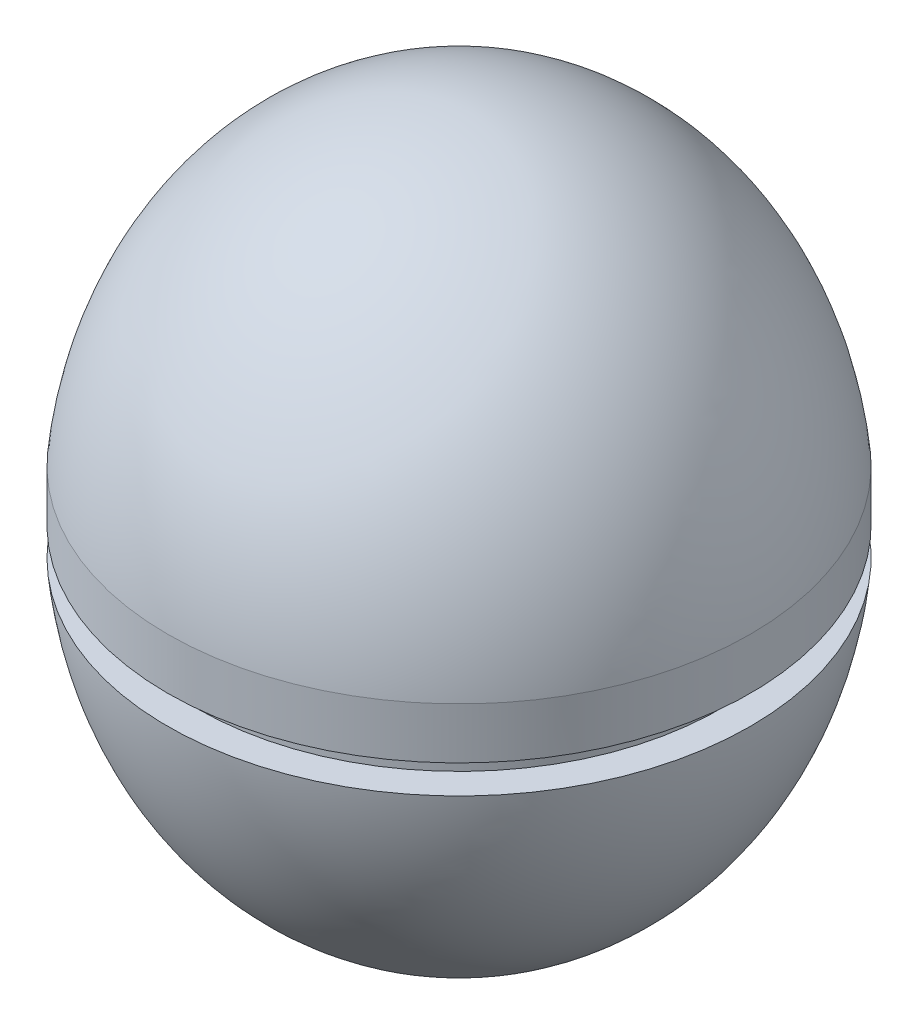
ISO-10303-21;
HEADER;
FILE_DESCRIPTION(('STEP AP214'),'2;1');
FILE_NAME('part.step','',(''),(''),'','','');
FILE_SCHEMA(('AUTOMOTIVE_DESIGN { 1 0 10303 214 1 1 1 1 }'));
ENDSEC;
DATA;
#1=APPLICATION_CONTEXT('core data for automotive mechanical design processes');
#2=APPLICATION_PROTOCOL_DEFINITION('international standard','automotive_design',2000,#1);
#3=PRODUCT_CONTEXT('',#1,'mechanical');
#4=PRODUCT('Part','Part','',(#3));
#5=PRODUCT_RELATED_PRODUCT_CATEGORY('part','',(#4));
#6=PRODUCT_DEFINITION_FORMATION('','',#4);
#7=PRODUCT_DEFINITION_CONTEXT('part definition',#1,'design');
#8=PRODUCT_DEFINITION('design','',#6,#7);
#9=PRODUCT_DEFINITION_SHAPE('','',#8);
#10=(LENGTH_UNIT() NAMED_UNIT(*) SI_UNIT(.MILLI.,.METRE.));
#11=(NAMED_UNIT(*) PLANE_ANGLE_UNIT() SI_UNIT($,.RADIAN.));
#12=(NAMED_UNIT(*) SI_UNIT($,.STERADIAN.) SOLID_ANGLE_UNIT());
#13=UNCERTAINTY_MEASURE_WITH_UNIT(LENGTH_MEASURE(1.E-05),#10,'distance_accuracy_value','');
#14=(GEOMETRIC_REPRESENTATION_CONTEXT(3) GLOBAL_UNCERTAINTY_ASSIGNED_CONTEXT((#13)) GLOBAL_UNIT_ASSIGNED_CONTEXT((#10,
#11,#12)) REPRESENTATION_CONTEXT('',''));
#15=CARTESIAN_POINT('',(0.,0.,0.));
#16=DIRECTION('',(0.,0.,1.));
#17=DIRECTION('',(1.,0.,0.));
#18=AXIS2_PLACEMENT_3D('',#15,#16,#17);
#19=CARTESIAN_POINT('',(-39.751866797119,-1.49999999999997,0.));
#20=DIRECTION('',(0.,-1.,0.));
#21=DIRECTION('',(0.,0.,-1.));
#22=AXIS2_PLACEMENT_3D('',#19,#20,#21);
#23=PLANE('',#22);
#24=CARTESIAN_POINT('',(0.,-1.49999999999997,0.));
#25=DIRECTION('',(0.,-1.,0.));
#26=DIRECTION('',(0.,0.,-1.));
#27=AXIS2_PLACEMENT_3D('',#24,#25,#26);
#28=CIRCLE('',#27,38.7411724744243);
#29=CARTESIAN_POINT('',(0.,-1.49999999999997,-38.7411724744243));
#30=VERTEX_POINT('',#29);
#31=EDGE_CURVE('E59',#30,#30,#28,.F.);
#32=ORIENTED_EDGE('',*,*,#31,.F.);
#33=EDGE_LOOP('',(#32));
#34=FACE_BOUND('',#33,.T.);
#35=CARTESIAN_POINT('',(0.,-1.49999999999997,0.));
#36=DIRECTION('',(0.,1.,0.));
#37=DIRECTION('',(0.,0.,1.));
#38=AXIS2_PLACEMENT_3D('',#35,#36,#37);
#39=CIRCLE('',#38,34.7411724744243);
#40=CARTESIAN_POINT('',(0.,-1.49999999999997,34.7411724744243));
#41=VERTEX_POINT('',#40);
#42=EDGE_CURVE('E64',#41,#41,#39,.T.);
#43=ORIENTED_EDGE('',*,*,#42,.T.);
#44=EDGE_LOOP('',(#43));
#45=FACE_BOUND('',#44,.T.);
#46=ADVANCED_FACE('F56',(#34,#45),#23,.T.);
#47=CARTESIAN_POINT('',(-34.7411724744243,4.24999999999999,0.));
#48=DIRECTION('',(0.,-1.,0.));
#49=DIRECTION('',(0.,0.,-1.));
#50=AXIS2_PLACEMENT_3D('',#47,#48,#49);
#51=PLANE('',#50);
#52=CARTESIAN_POINT('',(0.,4.24999999999999,0.));
#53=DIRECTION('',(0.,1.,0.));
#54=DIRECTION('',(0.,0.,1.));
#55=AXIS2_PLACEMENT_3D('',#52,#53,#54);
#56=CIRCLE('',#55,34.7411724744243);
#57=CARTESIAN_POINT('',(0.,4.24999999999999,34.7411724744243));
#58=VERTEX_POINT('',#57);
#59=EDGE_CURVE('E12',#58,#58,#56,.T.);
#60=ORIENTED_EDGE('',*,*,#59,.F.);
#61=EDGE_LOOP('',(#60));
#62=FACE_BOUND('',#61,.T.);
#63=CARTESIAN_POINT('',(0.,4.24999999999999,0.));
#64=DIRECTION('',(0.,-1.,0.));
#65=DIRECTION('',(0.,0.,-1.));
#66=AXIS2_PLACEMENT_3D('',#63,#64,#65);
#67=CIRCLE('',#66,32.7411724744243);
#68=CARTESIAN_POINT('',(0.,4.24999999999999,-32.7411724744243));
#69=VERTEX_POINT('',#68);
#70=EDGE_CURVE('E114',#69,#69,#67,.F.);
#71=ORIENTED_EDGE('',*,*,#70,.T.);
#72=EDGE_LOOP('',(#71));
#73=FACE_BOUND('',#72,.T.);
#74=ADVANCED_FACE('F77',(#62,#73),#51,.T.);
#75=CARTESIAN_POINT('',(0.,0.,0.));
#76=DIRECTION('',(0.,1.,0.));
#77=DIRECTION('',(0.,0.,1.));
#78=AXIS2_PLACEMENT_3D('',#75,#76,#77);
#79=CYLINDRICAL_SURFACE('',#78,34.7411724744243);
#80=ORIENTED_EDGE('',*,*,#42,.F.);
#81=EDGE_LOOP('',(#80));
#82=FACE_BOUND('',#81,.T.);
#83=ORIENTED_EDGE('',*,*,#59,.T.);
#84=EDGE_LOOP('',(#83));
#85=FACE_BOUND('',#84,.T.);
#86=ADVANCED_FACE('F75',(#82,#85),#79,.F.);
#87=CARTESIAN_POINT('',(0.,0.,0.));
#88=DIRECTION('',(0.,0.,-1.));
#89=DIRECTION('',(0.,1.,0.));
#90=AXIS2_PLACEMENT_3D('',#87,#88,#89);
#91=ELLIPSE('',#90,40.,33.);
#92=TRIMMED_CURVE('',#91,(PARAMETER_VALUE(0.)),(PARAMETER_VALUE(3.14159265358979)),.T.,.PARAMETER.);
#93=CARTESIAN_POINT('',(0.,0.,0.));
#94=DIRECTION('',(0.,1.,0.));
#95=AXIS1_PLACEMENT('',#93,#94);
#96=SURFACE_OF_REVOLUTION('',#92,#95);
#97=CARTESIAN_POINT('',(0.,40.,0.));
#98=VERTEX_POINT('',#97);
#99=VERTEX_LOOP('',#98);
#100=FACE_BOUND('',#99,.T.);
#101=CARTESIAN_POINT('',(0.,4.99999999999999,0.));
#102=DIRECTION('',(0.,1.,0.));
#103=DIRECTION('',(0.,0.,1.));
#104=AXIS2_PLACEMENT_3D('',#101,#102,#103);
#105=CIRCLE('',#104,32.7411724744243);
#106=CARTESIAN_POINT('',(0.,4.99999999999999,32.7411724744243));
#107=VERTEX_POINT('',#106);
#108=EDGE_CURVE('E80',#107,#107,#105,.T.);
#109=ORIENTED_EDGE('',*,*,#108,.F.);
#110=EDGE_LOOP('',(#109));
#111=FACE_BOUND('',#110,.T.);
#112=ADVANCED_FACE('F71',(#100,#111),#96,.T.);
#113=CARTESIAN_POINT('',(0.,0.,0.));
#114=DIRECTION('',(0.,1.,0.));
#115=DIRECTION('',(0.,0.,1.));
#116=AXIS2_PLACEMENT_3D('',#113,#114,#115);
#117=CYLINDRICAL_SURFACE('',#116,32.7411724744243);
#118=ORIENTED_EDGE('',*,*,#70,.F.);
#119=EDGE_LOOP('',(#118));
#120=FACE_BOUND('',#119,.T.);
#121=ORIENTED_EDGE('',*,*,#108,.T.);
#122=EDGE_LOOP('',(#121));
#123=FACE_BOUND('',#122,.T.);
#124=ADVANCED_FACE('F74',(#120,#123),#117,.F.);
#125=CARTESIAN_POINT('',(0.,46.,0.));
#126=CARTESIAN_POINT('',(2.43750808219156,46.,0.));
#127=CARTESIAN_POINT('',(4.87478854043028,45.7305054947189,0.));
#128=CARTESIAN_POINT('',(9.65016139074257,44.6677839082201,0.));
#129=CARTESIAN_POINT('',(11.9879386111832,43.8748285797408,0.));
#130=CARTESIAN_POINT('',(16.4769880292201,41.8071254197173,0.));
#131=CARTESIAN_POINT('',(18.6282067880805,40.5326990588235,0.));
#132=CARTESIAN_POINT('',(22.6748843654917,37.5608628589535,0.));
#133=CARTESIAN_POINT('',(24.5704432487271,35.8636555448346,0.));
#134=CARTESIAN_POINT('',(28.0533745007805,32.1135859269213,0.));
#135=CARTESIAN_POINT('',(29.6408575447832,30.0608033465646,0.));
#136=CARTESIAN_POINT('',(32.4683878550123,25.6712950540091,0.));
#137=CARTESIAN_POINT('',(33.7084976267559,23.3345928727547,0.));
#138=CARTESIAN_POINT('',(35.8124620976494,18.4520544171715,0.));
#139=CARTESIAN_POINT('',(36.676336571535,15.9062360869494,0.));
#140=CARTESIAN_POINT('',(38.0082581384073,10.6829142388074,0.));
#141=CARTESIAN_POINT('',(38.476305103022,8.0054412947938,0.));
#142=CARTESIAN_POINT('',(38.7411724744243,5.30182976688779,0.));
#143=B_SPLINE_CURVE_WITH_KNOTS('',3,(#125,#126,#127,#128,#129,#130,#131,#132,#133,#134,#135,
#136,#137,#138,#139,#140,#141,#142),.UNSPECIFIED.,.F.,.F.,(4,2,2,2,2,2,2,2,4),(0.,0.125,0.25,
0.375,0.5,0.625,0.75,0.875,1.),.UNSPECIFIED.);
#144=CARTESIAN_POINT('',(0.,0.,0.));
#145=DIRECTION('',(0.,1.,0.));
#146=AXIS1_PLACEMENT('',#144,#145);
#147=SURFACE_OF_REVOLUTION('',#143,#146);
#148=CARTESIAN_POINT('',(0.,5.30182976688779,0.));
#149=DIRECTION('',(0.,1.,0.));
#150=DIRECTION('',(0.,0.,1.));
#151=AXIS2_PLACEMENT_3D('',#148,#149,#150);
#152=CIRCLE('',#151,38.7411724744243);
#153=CARTESIAN_POINT('',(0.,5.30182976688779,38.7411724744243));
#154=VERTEX_POINT('',#153);
#155=EDGE_CURVE('E82',#154,#154,#152,.T.);
#156=ORIENTED_EDGE('',*,*,#155,.T.);
#157=EDGE_LOOP('',(#156));
#158=FACE_BOUND('',#157,.T.);
#159=CARTESIAN_POINT('',(0.,46.,0.));
#160=VERTEX_POINT('',#159);
#161=VERTEX_LOOP('',#160);
#162=FACE_BOUND('',#161,.T.);
#163=ADVANCED_FACE('F96',(#158,#162),#147,.F.);
#164=CARTESIAN_POINT('',(0.,0.,0.));
#165=DIRECTION('',(0.,1.,0.));
#166=DIRECTION('',(0.,0.,1.));
#167=AXIS2_PLACEMENT_3D('',#164,#165,#166);
#168=CYLINDRICAL_SURFACE('',#167,38.7411724744243);
#169=ORIENTED_EDGE('',*,*,#155,.F.);
#170=EDGE_LOOP('',(#169));
#171=FACE_BOUND('',#170,.T.);
#172=ORIENTED_EDGE('',*,*,#31,.T.);
#173=EDGE_LOOP('',(#172));
#174=FACE_BOUND('',#173,.T.);
#175=ADVANCED_FACE('F100',(#171,#174),#168,.T.);
#176=CLOSED_SHELL('',(#46,#74,#86,#112,#124,#163,#175));
#177=MANIFOLD_SOLID_BREP('B2',#176);
#178=CARTESIAN_POINT('',(-34.7411724744243,4.24999999999999,0.));
#179=DIRECTION('',(0.,-1.,0.));
#180=DIRECTION('',(0.,0.,-1.));
#181=AXIS2_PLACEMENT_3D('',#178,#179,#180);
#182=PLANE('',#181);
#183=CARTESIAN_POINT('',(0.,4.24999999999999,0.));
#184=DIRECTION('',(0.,-1.,0.));
#185=DIRECTION('',(0.,0.,-1.));
#186=AXIS2_PLACEMENT_3D('',#183,#184,#185);
#187=CIRCLE('',#186,32.7411724744243);
#188=CARTESIAN_POINT('',(0.,4.24999999999999,-32.7411724744243));
#189=VERTEX_POINT('',#188);
#190=EDGE_CURVE('E196',#189,#189,#187,.F.);
#191=ORIENTED_EDGE('',*,*,#190,.F.);
#192=EDGE_LOOP('',(#191));
#193=FACE_BOUND('',#192,.T.);
#194=CARTESIAN_POINT('',(0.,4.24999999999999,0.));
#195=DIRECTION('',(0.,1.,0.));
#196=DIRECTION('',(0.,0.,1.));
#197=AXIS2_PLACEMENT_3D('',#194,#195,#196);
#198=CIRCLE('',#197,34.7411724744243);
#199=CARTESIAN_POINT('',(0.,4.24999999999999,34.7411724744243));
#200=VERTEX_POINT('',#199);
#201=EDGE_CURVE('E192',#200,#200,#198,.T.);
#202=ORIENTED_EDGE('',*,*,#201,.T.);
#203=EDGE_LOOP('',(#202));
#204=FACE_BOUND('',#203,.T.);
#205=ADVANCED_FACE('F187',(#193,#204),#182,.F.);
#206=CARTESIAN_POINT('',(0.,0.,0.));
#207=DIRECTION('',(0.,1.,0.));
#208=DIRECTION('',(0.,0.,1.));
#209=AXIS2_PLACEMENT_3D('',#206,#207,#208);
#210=CYLINDRICAL_SURFACE('',#209,34.7411724744243);
#211=ORIENTED_EDGE('',*,*,#201,.F.);
#212=EDGE_LOOP('',(#211));
#213=FACE_BOUND('',#212,.T.);
#214=CARTESIAN_POINT('',(0.,-5.30182976688777,0.));
#215=DIRECTION('',(0.,-1.,0.));
#216=DIRECTION('',(0.,0.,-1.));
#217=AXIS2_PLACEMENT_3D('',#214,#215,#216);
#218=CIRCLE('',#217,34.7411724744243);
#219=CARTESIAN_POINT('',(0.,-5.30182976688777,-34.7411724744243));
#220=VERTEX_POINT('',#219);
#221=EDGE_CURVE('E241',#220,#220,#218,.F.);
#222=ORIENTED_EDGE('',*,*,#221,.T.);
#223=EDGE_LOOP('',(#222));
#224=FACE_BOUND('',#223,.T.);
#225=ADVANCED_FACE('F207',(#213,#224),#210,.T.);
#226=CARTESIAN_POINT('',(0.,0.,0.));
#227=DIRECTION('',(0.,1.,0.));
#228=DIRECTION('',(0.,0.,1.));
#229=AXIS2_PLACEMENT_3D('',#226,#227,#228);
#230=CYLINDRICAL_SURFACE('',#229,32.7411724744243);
#231=CARTESIAN_POINT('',(0.,-4.99999999999997,0.));
#232=DIRECTION('',(0.,1.,0.));
#233=DIRECTION('',(0.,0.,1.));
#234=AXIS2_PLACEMENT_3D('',#231,#232,#233);
#235=CIRCLE('',#234,32.7411724744243);
#236=CARTESIAN_POINT('',(0.,-4.99999999999997,32.7411724744243));
#237=VERTEX_POINT('',#236);
#238=EDGE_CURVE('E54',#237,#237,#235,.T.);
#239=ORIENTED_EDGE('',*,*,#238,.F.);
#240=EDGE_LOOP('',(#239));
#241=FACE_BOUND('',#240,.T.);
#242=ORIENTED_EDGE('',*,*,#190,.T.);
#243=EDGE_LOOP('',(#242));
#244=FACE_BOUND('',#243,.T.);
#245=ADVANCED_FACE('F205',(#241,#244),#230,.F.);
#246=CARTESIAN_POINT('',(0.,0.,0.));
#247=DIRECTION('',(0.,0.,-1.));
#248=DIRECTION('',(0.,1.,0.));
#249=AXIS2_PLACEMENT_3D('',#246,#247,#248);
#250=ELLIPSE('',#249,40.,33.);
#251=TRIMMED_CURVE('',#250,(PARAMETER_VALUE(0.)),(PARAMETER_VALUE(3.14159265358979)),.T.,.PARAMETER.);
#252=CARTESIAN_POINT('',(0.,0.,0.));
#253=DIRECTION('',(0.,1.,0.));
#254=AXIS1_PLACEMENT('',#252,#253);
#255=SURFACE_OF_REVOLUTION('',#251,#254);
#256=ORIENTED_EDGE('',*,*,#238,.T.);
#257=EDGE_LOOP('',(#256));
#258=FACE_BOUND('',#257,.T.);
#259=CARTESIAN_POINT('',(0.,-40.,0.));
#260=VERTEX_POINT('',#259);
#261=VERTEX_LOOP('',#260);
#262=FACE_BOUND('',#261,.T.);
#263=ADVANCED_FACE('F189',(#258,#262),#255,.T.);
#264=CARTESIAN_POINT('',(0.,-5.30182976688777,0.));
#265=DIRECTION('',(0.,-1.,0.));
#266=DIRECTION('',(0.,0.,-1.));
#267=AXIS2_PLACEMENT_3D('',#264,#265,#266);
#268=PLANE('',#267);
#269=CARTESIAN_POINT('',(0.,-5.30182976688777,0.));
#270=DIRECTION('',(0.,-1.,0.));
#271=DIRECTION('',(0.,0.,-1.));
#272=AXIS2_PLACEMENT_3D('',#269,#270,#271);
#273=CIRCLE('',#272,38.7411724744243);
#274=CARTESIAN_POINT('',(0.,-5.30182976688777,-38.7411724744243));
#275=VERTEX_POINT('',#274);
#276=EDGE_CURVE('E244',#275,#275,#273,.F.);
#277=ORIENTED_EDGE('',*,*,#276,.T.);
#278=EDGE_LOOP('',(#277));
#279=FACE_BOUND('',#278,.T.);
#280=ORIENTED_EDGE('',*,*,#221,.F.);
#281=EDGE_LOOP('',(#280));
#282=FACE_BOUND('',#281,.T.);
#283=ADVANCED_FACE('F204',(#279,#282),#268,.F.);
#284=CARTESIAN_POINT('',(38.7411724744243,-5.30182976688778,0.));
#285=CARTESIAN_POINT('',(38.476305103022,-8.00544129479378,0.));
#286=CARTESIAN_POINT('',(38.0082581384073,-10.6829142388074,0.));
#287=CARTESIAN_POINT('',(36.676336571535,-15.9062360869494,0.));
#288=CARTESIAN_POINT('',(35.8124620976494,-18.4520544171714,0.));
#289=CARTESIAN_POINT('',(33.7084976267559,-23.3345928727547,0.));
#290=CARTESIAN_POINT('',(32.4683878550123,-25.6712950540091,0.));
#291=CARTESIAN_POINT('',(29.6408575447833,-30.0608033465646,0.));
#292=CARTESIAN_POINT('',(28.0533745007805,-32.1135859269213,0.));
#293=CARTESIAN_POINT('',(24.5704432487272,-35.8636555448346,0.));
#294=CARTESIAN_POINT('',(22.6748843654917,-37.5608628589535,0.));
#295=CARTESIAN_POINT('',(18.6282067880805,-40.5326990588235,0.));
#296=CARTESIAN_POINT('',(16.4769880292201,-41.8071254197173,0.));
#297=CARTESIAN_POINT('',(11.9879386111832,-43.8748285797408,0.));
#298=CARTESIAN_POINT('',(9.6501613907426,-44.6677839082201,0.));
#299=CARTESIAN_POINT('',(4.8747885404303,-45.7305054947189,0.));
#300=CARTESIAN_POINT('',(2.43750808219157,-46.,0.));
#301=CARTESIAN_POINT('',(0.,-46.,0.));
#302=B_SPLINE_CURVE_WITH_KNOTS('',3,(#284,#285,#286,#287,#288,#289,#290,#291,#292,#293,#294,
#295,#296,#297,#298,#299,#300,#301),.UNSPECIFIED.,.F.,.F.,(4,2,2,2,2,2,2,2,4),(0.,0.125,0.25,
0.375,0.5,0.625,0.75,0.875,1.),.UNSPECIFIED.);
#303=CARTESIAN_POINT('',(0.,0.,0.));
#304=DIRECTION('',(0.,1.,0.));
#305=AXIS1_PLACEMENT('',#303,#304);
#306=SURFACE_OF_REVOLUTION('',#302,#305);
#307=CARTESIAN_POINT('',(0.,-46.,0.));
#308=VERTEX_POINT('',#307);
#309=VERTEX_LOOP('',#308);
#310=FACE_BOUND('',#309,.T.);
#311=ORIENTED_EDGE('',*,*,#276,.F.);
#312=EDGE_LOOP('',(#311));
#313=FACE_BOUND('',#312,.T.);
#314=ADVANCED_FACE('F212',(#310,#313),#306,.F.);
#315=CLOSED_SHELL('',(#205,#225,#245,#263,#283,#314));
#316=MANIFOLD_SOLID_BREP('B6',#315);
#317=ADVANCED_BREP_SHAPE_REPRESENTATION('',(#18,#177,#316),#14);
#318=SHAPE_DEFINITION_REPRESENTATION(#9,#317);
ENDSEC;
END-ISO-10303-21;
